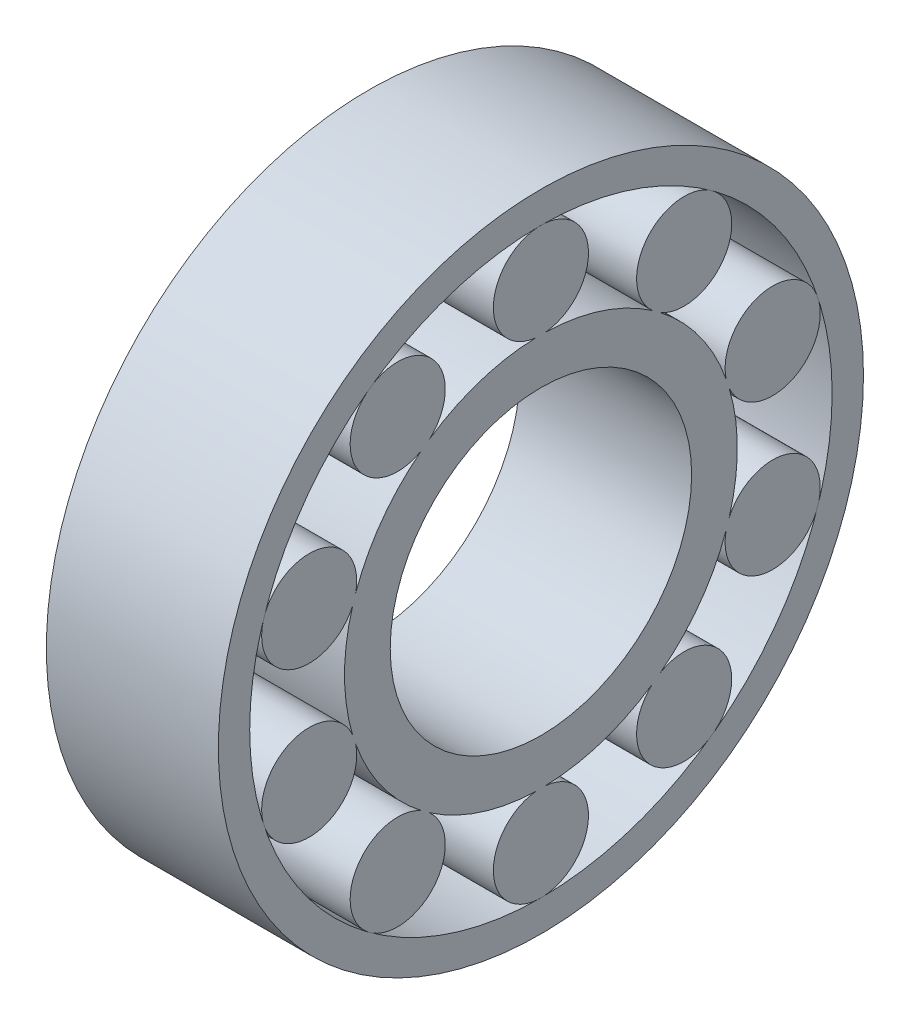
ISO-10303-21;
HEADER;
FILE_DESCRIPTION(('STEP AP214'),'2;1');
FILE_NAME('part.step','',(''),(''),'','','');
FILE_SCHEMA(('AUTOMOTIVE_DESIGN { 1 0 10303 214 1 1 1 1 }'));
ENDSEC;
DATA;
#1=APPLICATION_CONTEXT('core data for automotive mechanical design processes');
#2=APPLICATION_PROTOCOL_DEFINITION('international standard','automotive_design',2000,#1);
#3=PRODUCT_CONTEXT('',#1,'mechanical');
#4=PRODUCT('Part','Part','',(#3));
#5=PRODUCT_RELATED_PRODUCT_CATEGORY('part','',(#4));
#6=PRODUCT_DEFINITION_FORMATION('','',#4);
#7=PRODUCT_DEFINITION_CONTEXT('part definition',#1,'design');
#8=PRODUCT_DEFINITION('design','',#6,#7);
#9=PRODUCT_DEFINITION_SHAPE('','',#8);
#10=(LENGTH_UNIT() NAMED_UNIT(*) SI_UNIT(.MILLI.,.METRE.));
#11=(NAMED_UNIT(*) PLANE_ANGLE_UNIT() SI_UNIT($,.RADIAN.));
#12=(NAMED_UNIT(*) SI_UNIT($,.STERADIAN.) SOLID_ANGLE_UNIT());
#13=UNCERTAINTY_MEASURE_WITH_UNIT(LENGTH_MEASURE(1.E-05),#10,'distance_accuracy_value','');
#14=(GEOMETRIC_REPRESENTATION_CONTEXT(3) GLOBAL_UNCERTAINTY_ASSIGNED_CONTEXT((#13)) GLOBAL_UNIT_ASSIGNED_CONTEXT((#10,
#11,#12)) REPRESENTATION_CONTEXT('',''));
#15=CARTESIAN_POINT('',(0.,0.,0.));
#16=DIRECTION('',(0.,0.,1.));
#17=DIRECTION('',(1.,0.,0.));
#18=AXIS2_PLACEMENT_3D('',#15,#16,#17);
#19=CARTESIAN_POINT('',(12.7,0.,0.));
#20=DIRECTION('',(1.,0.,0.));
#21=DIRECTION('',(0.,0.,-1.));
#22=AXIS2_PLACEMENT_3D('',#19,#20,#21);
#23=PLANE('',#22);
#24=CARTESIAN_POINT('',(12.7,0.,0.));
#25=DIRECTION('',(1.,0.,0.));
#26=DIRECTION('',(0.,0.,-1.));
#27=AXIS2_PLACEMENT_3D('',#24,#25,#26);
#28=CIRCLE('',#27,21.5);
#29=CARTESIAN_POINT('',(12.7,0.,-21.5));
#30=VERTEX_POINT('',#29);
#31=EDGE_CURVE('E12',#30,#30,#28,.T.);
#32=ORIENTED_EDGE('',*,*,#31,.F.);
#33=EDGE_LOOP('',(#32));
#34=FACE_BOUND('',#33,.T.);
#35=CARTESIAN_POINT('',(12.7,0.,0.));
#36=DIRECTION('',(1.,0.,0.));
#37=DIRECTION('',(0.,0.,-1.));
#38=AXIS2_PLACEMENT_3D('',#35,#36,#37);
#39=CIRCLE('',#38,23.8125);
#40=CARTESIAN_POINT('',(12.7,0.,-23.8125));
#41=VERTEX_POINT('',#40);
#42=EDGE_CURVE('E71',#41,#41,#39,.T.);
#43=ORIENTED_EDGE('',*,*,#42,.T.);
#44=EDGE_LOOP('',(#43));
#45=FACE_BOUND('',#44,.T.);
#46=ADVANCED_FACE('F56',(#34,#45),#23,.T.);
#47=CARTESIAN_POINT('',(0.,0.,0.));
#48=DIRECTION('',(1.,0.,0.));
#49=DIRECTION('',(0.,0.,-1.));
#50=AXIS2_PLACEMENT_3D('',#47,#48,#49);
#51=PLANE('',#50);
#52=CARTESIAN_POINT('',(0.,0.,0.));
#53=DIRECTION('',(1.,0.,0.));
#54=DIRECTION('',(0.,0.,-1.));
#55=AXIS2_PLACEMENT_3D('',#52,#53,#54);
#56=CIRCLE('',#55,21.5);
#57=CARTESIAN_POINT('',(0.,0.,-21.5));
#58=VERTEX_POINT('',#57);
#59=EDGE_CURVE('E64',#58,#58,#56,.T.);
#60=ORIENTED_EDGE('',*,*,#59,.T.);
#61=EDGE_LOOP('',(#60));
#62=FACE_BOUND('',#61,.T.);
#63=CARTESIAN_POINT('',(0.,0.,0.));
#64=DIRECTION('',(1.,0.,0.));
#65=DIRECTION('',(0.,0.,-1.));
#66=AXIS2_PLACEMENT_3D('',#63,#64,#65);
#67=CIRCLE('',#66,23.8125);
#68=CARTESIAN_POINT('',(0.,0.,-23.8125));
#69=VERTEX_POINT('',#68);
#70=EDGE_CURVE('E70',#69,#69,#67,.T.);
#71=ORIENTED_EDGE('',*,*,#70,.F.);
#72=EDGE_LOOP('',(#71));
#73=FACE_BOUND('',#72,.T.);
#74=ADVANCED_FACE('F62',(#62,#73),#51,.F.);
#75=CARTESIAN_POINT('',(12.7,0.,0.));
#76=DIRECTION('',(-1.,0.,0.));
#77=DIRECTION('',(0.,0.,1.));
#78=AXIS2_PLACEMENT_3D('',#75,#76,#77);
#79=CYLINDRICAL_SURFACE('',#78,23.8125);
#80=ORIENTED_EDGE('',*,*,#42,.F.);
#81=EDGE_LOOP('',(#80));
#82=FACE_BOUND('',#81,.T.);
#83=ORIENTED_EDGE('',*,*,#70,.T.);
#84=EDGE_LOOP('',(#83));
#85=FACE_BOUND('',#84,.T.);
#86=ADVANCED_FACE('F81',(#82,#85),#79,.T.);
#87=CARTESIAN_POINT('',(0.,0.,0.));
#88=DIRECTION('',(1.,0.,0.));
#89=DIRECTION('',(0.,0.,-1.));
#90=AXIS2_PLACEMENT_3D('',#87,#88,#89);
#91=CYLINDRICAL_SURFACE('',#90,21.5);
#92=ORIENTED_EDGE('',*,*,#31,.T.);
#93=EDGE_LOOP('',(#92));
#94=FACE_BOUND('',#93,.T.);
#95=ORIENTED_EDGE('',*,*,#59,.F.);
#96=EDGE_LOOP('',(#95));
#97=FACE_BOUND('',#96,.T.);
#98=ADVANCED_FACE('F85',(#94,#97),#91,.F.);
#99=CLOSED_SHELL('',(#46,#74,#86,#98));
#100=MANIFOLD_SOLID_BREP('B2',#99);
#101=CARTESIAN_POINT('',(0.,0.,0.));
#102=DIRECTION('',(1.,0.,0.));
#103=DIRECTION('',(0.,0.,-1.));
#104=AXIS2_PLACEMENT_3D('',#101,#102,#103);
#105=CYLINDRICAL_SURFACE('',#104,14.5);
#106=DIRECTION('',(1.,0.,0.));
#107=VECTOR('',#106,1.);
#108=CARTESIAN_POINT('',(6.35,11.5161112431725,8.81074241110673));
#109=LINE('',#108,#107);
#110=CARTESIAN_POINT('',(0.,11.5161112431725,8.81074241110675));
#111=VERTEX_POINT('',#110);
#112=CARTESIAN_POINT('',(12.7,11.5161112431725,8.81074241110675));
#113=VERTEX_POINT('',#112);
#114=EDGE_CURVE('E60',#111,#113,#109,.T.);
#115=ORIENTED_EDGE('',*,*,#114,.F.);
#116=CARTESIAN_POINT('',(0.,0.,0.));
#117=DIRECTION('',(1.,0.,0.));
#118=DIRECTION('',(0.,0.,-1.));
#119=AXIS2_PLACEMENT_3D('',#116,#117,#118);
#120=CIRCLE('',#119,14.5);
#121=CARTESIAN_POINT('',(0.,4.82083990023876,13.6751417782876));
#122=VERTEX_POINT('',#121);
#123=EDGE_CURVE('E257',#111,#122,#120,.T.);
#124=ORIENTED_EDGE('',*,*,#123,.T.);
#125=DIRECTION('',(1.,0.,0.));
#126=VECTOR('',#125,1.);
#127=CARTESIAN_POINT('',(6.35,4.82083990023876,13.6751417782876));
#128=LINE('',#127,#126);
#129=CARTESIAN_POINT('',(12.7,4.82083990023876,13.6751417782876));
#130=VERTEX_POINT('',#129);
#131=EDGE_CURVE('E425',#130,#122,#128,.F.);
#132=ORIENTED_EDGE('',*,*,#131,.F.);
#133=CARTESIAN_POINT('',(12.7,0.,0.));
#134=DIRECTION('',(1.,0.,0.));
#135=DIRECTION('',(0.,0.,-1.));
#136=AXIS2_PLACEMENT_3D('',#133,#134,#135);
#137=CIRCLE('',#136,14.5);
#138=EDGE_CURVE('E131',#113,#130,#137,.T.);
#139=ORIENTED_EDGE('',*,*,#138,.F.);
#140=EDGE_LOOP('',(#115,#124,#132,#139));
#141=FACE_BOUND('',#140,.T.);
#142=ADVANCED_FACE('F113',(#141),#105,.T.);
#143=DIRECTION('',(1.,0.,0.));
#144=VECTOR('',#143,1.);
#145=CARTESIAN_POINT('',(6.35,4.13790525383129,13.8970406961452));
#146=LINE('',#145,#144);
#147=CARTESIAN_POINT('',(0.,4.13790525383129,13.8970406961452));
#148=VERTEX_POINT('',#147);
#149=CARTESIAN_POINT('',(12.7,4.13790525383129,13.8970406961452));
#150=VERTEX_POINT('',#149);
#151=EDGE_CURVE('E271',#148,#150,#146,.T.);
#152=ORIENTED_EDGE('',*,*,#151,.F.);
#153=CARTESIAN_POINT('',(0.,-4.13790525382628,13.8970406961467));
#154=VERTEX_POINT('',#153);
#155=EDGE_CURVE('E439',#148,#154,#120,.T.);
#156=ORIENTED_EDGE('',*,*,#155,.T.);
#157=DIRECTION('',(1.,0.,0.));
#158=VECTOR('',#157,1.);
#159=CARTESIAN_POINT('',(6.35,-4.13790525382629,13.8970406961467));
#160=LINE('',#159,#158);
#161=CARTESIAN_POINT('',(12.7,-4.13790525382628,13.8970406961467));
#162=VERTEX_POINT('',#161);
#163=EDGE_CURVE('E411',#162,#154,#160,.F.);
#164=ORIENTED_EDGE('',*,*,#163,.F.);
#165=EDGE_CURVE('E436',#150,#162,#137,.T.);
#166=ORIENTED_EDGE('',*,*,#165,.F.);
#167=EDGE_LOOP('',(#152,#156,#164,#166));
#168=FACE_BOUND('',#167,.T.);
#169=ADVANCED_FACE('F532',(#168),#105,.T.);
#170=DIRECTION('',(1.,0.,0.));
#171=VECTOR('',#170,1.);
#172=CARTESIAN_POINT('',(6.35,-4.82083990024673,13.6751417782848));
#173=LINE('',#172,#171);
#174=CARTESIAN_POINT('',(0.,-4.82083990024675,13.6751417782847));
#175=VERTEX_POINT('',#174);
#176=CARTESIAN_POINT('',(12.7,-4.82083990024675,13.6751417782847));
#177=VERTEX_POINT('',#176);
#178=EDGE_CURVE('E416',#175,#177,#173,.T.);
#179=ORIENTED_EDGE('',*,*,#178,.F.);
#180=CARTESIAN_POINT('',(0.,-11.5161112431625,8.81074241111981));
#181=VERTEX_POINT('',#180);
#182=EDGE_CURVE('E444',#175,#181,#120,.T.);
#183=ORIENTED_EDGE('',*,*,#182,.T.);
#184=DIRECTION('',(1.,0.,0.));
#185=VECTOR('',#184,1.);
#186=CARTESIAN_POINT('',(6.35,-11.5161112431625,8.81074241111984));
#187=LINE('',#186,#185);
#188=CARTESIAN_POINT('',(12.7,-11.5161112431625,8.81074241111981));
#189=VERTEX_POINT('',#188);
#190=EDGE_CURVE('E407',#189,#181,#187,.F.);
#191=ORIENTED_EDGE('',*,*,#190,.F.);
#192=EDGE_CURVE('E493',#177,#189,#137,.T.);
#193=ORIENTED_EDGE('',*,*,#192,.F.);
#194=EDGE_LOOP('',(#179,#183,#191,#193));
#195=FACE_BOUND('',#194,.T.);
#196=ADVANCED_FACE('F496',(#195),#105,.T.);
#197=DIRECTION('',(1.,0.,0.));
#198=VECTOR('',#197,1.);
#199=CARTESIAN_POINT('',(6.35,-11.9381880667453,8.22980350209049));
#200=LINE('',#199,#198);
#201=CARTESIAN_POINT('',(0.,-11.9381880667452,8.22980350209052));
#202=VERTEX_POINT('',#201);
#203=CARTESIAN_POINT('',(12.7,-11.9381880667452,8.22980350209052));
#204=VERTEX_POINT('',#203);
#205=EDGE_CURVE('E408',#202,#204,#200,.T.);
#206=ORIENTED_EDGE('',*,*,#205,.F.);
#207=CARTESIAN_POINT('',(0.,-14.4955541558351,0.359039991158161));
#208=VERTEX_POINT('',#207);
#209=EDGE_CURVE('E447',#202,#208,#120,.T.);
#210=ORIENTED_EDGE('',*,*,#209,.T.);
#211=DIRECTION('',(1.,0.,0.));
#212=VECTOR('',#211,1.);
#213=CARTESIAN_POINT('',(6.35,-14.4955541558351,0.35903999115814));
#214=LINE('',#213,#212);
#215=CARTESIAN_POINT('',(12.7,-14.4955541558351,0.359039991158161));
#216=VERTEX_POINT('',#215);
#217=EDGE_CURVE('E399',#216,#208,#214,.F.);
#218=ORIENTED_EDGE('',*,*,#217,.F.);
#219=EDGE_CURVE('E495',#204,#216,#137,.T.);
#220=ORIENTED_EDGE('',*,*,#219,.F.);
#221=EDGE_LOOP('',(#206,#210,#218,#220));
#222=FACE_BOUND('',#221,.T.);
#223=ADVANCED_FACE('F504',(#222),#105,.T.);
#224=DIRECTION('',(1.,0.,0.));
#225=VECTOR('',#224,1.);
#226=CARTESIAN_POINT('',(6.35,-14.495554155835,-0.359039991162222));
#227=LINE('',#226,#225);
#228=CARTESIAN_POINT('',(0.,-14.495554155835,-0.359039991162243));
#229=VERTEX_POINT('',#228);
#230=CARTESIAN_POINT('',(12.7,-14.495554155835,-0.359039991162243));
#231=VERTEX_POINT('',#230);
#232=EDGE_CURVE('E405',#229,#231,#227,.T.);
#233=ORIENTED_EDGE('',*,*,#232,.F.);
#234=CARTESIAN_POINT('',(0.,-11.9381880667326,-8.22980350210881));
#235=VERTEX_POINT('',#234);
#236=EDGE_CURVE('E448',#229,#235,#120,.T.);
#237=ORIENTED_EDGE('',*,*,#236,.T.);
#238=DIRECTION('',(1.,0.,0.));
#239=VECTOR('',#238,1.);
#240=CARTESIAN_POINT('',(6.35,-11.9381880667326,-8.22980350210885));
#241=LINE('',#240,#239);
#242=CARTESIAN_POINT('',(12.7,-11.9381880667326,-8.22980350210881));
#243=VERTEX_POINT('',#242);
#244=EDGE_CURVE('E388',#243,#235,#241,.F.);
#245=ORIENTED_EDGE('',*,*,#244,.F.);
#246=EDGE_CURVE('E489',#231,#243,#137,.T.);
#247=ORIENTED_EDGE('',*,*,#246,.F.);
#248=EDGE_LOOP('',(#233,#237,#245,#247));
#249=FACE_BOUND('',#248,.T.);
#250=ADVANCED_FACE('F506',(#249),#105,.T.);
#251=DIRECTION('',(1.,0.,0.));
#252=VECTOR('',#251,1.);
#253=CARTESIAN_POINT('',(6.35,-11.5161112431717,-8.81074241110787));
#254=LINE('',#253,#252);
#255=CARTESIAN_POINT('',(0.,-11.5161112431717,-8.8107424111079));
#256=VERTEX_POINT('',#255);
#257=CARTESIAN_POINT('',(12.7,-11.5161112431717,-8.8107424111079));
#258=VERTEX_POINT('',#257);
#259=EDGE_CURVE('E391',#256,#258,#254,.T.);
#260=ORIENTED_EDGE('',*,*,#259,.F.);
#261=CARTESIAN_POINT('',(0.,-4.82083990021603,-13.6751417782956));
#262=VERTEX_POINT('',#261);
#263=EDGE_CURVE('E453',#256,#262,#120,.T.);
#264=ORIENTED_EDGE('',*,*,#263,.T.);
#265=DIRECTION('',(1.,0.,0.));
#266=VECTOR('',#265,1.);
#267=CARTESIAN_POINT('',(6.35,-4.82083990021604,-13.6751417782956));
#268=LINE('',#267,#266);
#269=CARTESIAN_POINT('',(12.7,-4.82083990021603,-13.6751417782956));
#270=VERTEX_POINT('',#269);
#271=EDGE_CURVE('E385',#270,#262,#268,.F.);
#272=ORIENTED_EDGE('',*,*,#271,.F.);
#273=EDGE_CURVE('E488',#258,#270,#137,.T.);
#274=ORIENTED_EDGE('',*,*,#273,.F.);
#275=EDGE_LOOP('',(#260,#264,#272,#274));
#276=FACE_BOUND('',#275,.T.);
#277=ADVANCED_FACE('F511',(#276),#105,.T.);
#278=DIRECTION('',(1.,0.,0.));
#279=VECTOR('',#278,1.);
#280=CARTESIAN_POINT('',(6.35,-4.13790525385293,-13.8970406961387));
#281=LINE('',#280,#279);
#282=CARTESIAN_POINT('',(0.,-4.13790525385294,-13.8970406961387));
#283=VERTEX_POINT('',#282);
#284=CARTESIAN_POINT('',(12.7,-4.13790525385294,-13.8970406961387));
#285=VERTEX_POINT('',#284);
#286=EDGE_CURVE('E387',#283,#285,#281,.T.);
#287=ORIENTED_EDGE('',*,*,#286,.F.);
#288=CARTESIAN_POINT('',(0.,4.1379052538615,-13.8970406961362));
#289=VERTEX_POINT('',#288);
#290=EDGE_CURVE('E458',#283,#289,#120,.T.);
#291=ORIENTED_EDGE('',*,*,#290,.T.);
#292=DIRECTION('',(1.,0.,0.));
#293=VECTOR('',#292,1.);
#294=CARTESIAN_POINT('',(6.35,4.13790525386153,-13.8970406961362));
#295=LINE('',#294,#293);
#296=CARTESIAN_POINT('',(12.7,4.1379052538615,-13.8970406961362));
#297=VERTEX_POINT('',#296);
#298=EDGE_CURVE('E372',#297,#289,#295,.F.);
#299=ORIENTED_EDGE('',*,*,#298,.F.);
#300=EDGE_CURVE('E486',#285,#297,#137,.T.);
#301=ORIENTED_EDGE('',*,*,#300,.F.);
#302=EDGE_LOOP('',(#287,#291,#299,#301));
#303=FACE_BOUND('',#302,.T.);
#304=ADVANCED_FACE('F516',(#303),#105,.T.);
#305=DIRECTION('',(1.,0.,0.));
#306=VECTOR('',#305,1.);
#307=CARTESIAN_POINT('',(6.35,4.82083990021062,-13.6751417782975));
#308=LINE('',#307,#306);
#309=CARTESIAN_POINT('',(0.,4.82083990021065,-13.6751417782975));
#310=VERTEX_POINT('',#309);
#311=CARTESIAN_POINT('',(12.7,4.82083990021065,-13.6751417782975));
#312=VERTEX_POINT('',#311);
#313=EDGE_CURVE('E378',#310,#312,#308,.T.);
#314=ORIENTED_EDGE('',*,*,#313,.F.);
#315=CARTESIAN_POINT('',(0.,11.5161112431843,-8.81074241109131));
#316=VERTEX_POINT('',#315);
#317=EDGE_CURVE('E463',#310,#316,#120,.T.);
#318=ORIENTED_EDGE('',*,*,#317,.T.);
#319=DIRECTION('',(1.,0.,0.));
#320=VECTOR('',#319,1.);
#321=CARTESIAN_POINT('',(6.35,11.5161112431844,-8.81074241109129));
#322=LINE('',#321,#320);
#323=CARTESIAN_POINT('',(12.7,11.5161112431843,-8.81074241109131));
#324=VERTEX_POINT('',#323);
#325=EDGE_CURVE('E368',#324,#316,#322,.F.);
#326=ORIENTED_EDGE('',*,*,#325,.F.);
#327=EDGE_CURVE('E482',#312,#324,#137,.T.);
#328=ORIENTED_EDGE('',*,*,#327,.F.);
#329=EDGE_LOOP('',(#314,#318,#326,#328));
#330=FACE_BOUND('',#329,.T.);
#331=ADVANCED_FACE('F524',(#330),#105,.T.);
#332=DIRECTION('',(1.,0.,0.));
#333=VECTOR('',#332,1.);
#334=CARTESIAN_POINT('',(6.35,11.9381880667226,-8.22980350212337));
#335=LINE('',#334,#333);
#336=CARTESIAN_POINT('',(0.,11.9381880667226,-8.22980350212336));
#337=VERTEX_POINT('',#336);
#338=CARTESIAN_POINT('',(12.7,11.9381880667226,-8.22980350212336));
#339=VERTEX_POINT('',#338);
#340=EDGE_CURVE('E367',#337,#339,#335,.T.);
#341=ORIENTED_EDGE('',*,*,#340,.F.);
#342=CARTESIAN_POINT('',(0.,14.4955541558357,-0.359039991136616));
#343=VERTEX_POINT('',#342);
#344=EDGE_CURVE('E265',#337,#343,#120,.T.);
#345=ORIENTED_EDGE('',*,*,#344,.T.);
#346=DIRECTION('',(1.,0.,0.));
#347=VECTOR('',#346,1.);
#348=CARTESIAN_POINT('',(6.35,14.4955541558357,-0.359039991136674));
#349=LINE('',#348,#347);
#350=CARTESIAN_POINT('',(12.7,14.4955541558357,-0.359039991136616));
#351=VERTEX_POINT('',#350);
#352=EDGE_CURVE('E360',#351,#343,#349,.F.);
#353=ORIENTED_EDGE('',*,*,#352,.F.);
#354=EDGE_CURVE('E347',#339,#351,#137,.T.);
#355=ORIENTED_EDGE('',*,*,#354,.F.);
#356=EDGE_LOOP('',(#341,#345,#353,#355));
#357=FACE_BOUND('',#356,.T.);
#358=ADVANCED_FACE('F480',(#357),#105,.T.);
#359=CARTESIAN_POINT('',(12.7,0.,0.));
#360=DIRECTION('',(1.,0.,0.));
#361=DIRECTION('',(0.,0.,-1.));
#362=AXIS2_PLACEMENT_3D('',#359,#360,#361);
#363=PLANE('',#362);
#364=CARTESIAN_POINT('',(12.7,14.4955541558357,0.359039991135765));
#365=VERTEX_POINT('',#364);
#366=CARTESIAN_POINT('',(12.7,11.9381880667341,8.22980350210672));
#367=VERTEX_POINT('',#366);
#368=EDGE_CURVE('E348',#365,#367,#137,.T.);
#369=ORIENTED_EDGE('',*,*,#368,.T.);
#370=CARTESIAN_POINT('',(12.7,14.5530629487508,10.5734191450063));
#371=DIRECTION('',(1.,0.,0.));
#372=DIRECTION('',(0.,0.,-1.));
#373=AXIS2_PLACEMENT_3D('',#370,#371,#372);
#374=CIRCLE('',#373,3.5114249145106);
#375=EDGE_CURVE('E267',#367,#113,#374,.T.);
#376=ORIENTED_EDGE('',*,*,#375,.T.);
#377=ORIENTED_EDGE('',*,*,#138,.T.);
#378=CARTESIAN_POINT('',(12.7,5.55877540600532,17.108151553919));
#379=DIRECTION('',(1.,0.,0.));
#380=DIRECTION('',(0.,0.,-1.));
#381=AXIS2_PLACEMENT_3D('',#378,#379,#380);
#382=CIRCLE('',#381,3.51142491451146);
#383=EDGE_CURVE('E276',#130,#150,#382,.T.);
#384=ORIENTED_EDGE('',*,*,#383,.T.);
#385=ORIENTED_EDGE('',*,*,#165,.T.);
#386=CARTESIAN_POINT('',(12.7,-5.55877540600723,17.1081515539184));
#387=DIRECTION('',(1.,0.,0.));
#388=DIRECTION('',(0.,0.,-1.));
#389=AXIS2_PLACEMENT_3D('',#386,#387,#388);
#390=CIRCLE('',#389,3.51142491451233);
#391=EDGE_CURVE('E290',#162,#177,#390,.T.);
#392=ORIENTED_EDGE('',*,*,#391,.T.);
#393=ORIENTED_EDGE('',*,*,#192,.T.);
#394=CARTESIAN_POINT('',(12.7,-14.553062948752,10.5734191450047));
#395=DIRECTION('',(1.,0.,0.));
#396=DIRECTION('',(0.,0.,-1.));
#397=AXIS2_PLACEMENT_3D('',#394,#395,#396);
#398=CIRCLE('',#397,3.51142491451289);
#399=EDGE_CURVE('E293',#189,#204,#398,.T.);
#400=ORIENTED_EDGE('',*,*,#399,.T.);
#401=ORIENTED_EDGE('',*,*,#219,.T.);
#402=CARTESIAN_POINT('',(12.7,-17.9885750854903,-2.53275452224936E-12));
#403=DIRECTION('',(1.,0.,0.));
#404=DIRECTION('',(0.,0.,-1.));
#405=AXIS2_PLACEMENT_3D('',#402,#403,#404);
#406=CIRCLE('',#405,3.51142491451287);
#407=EDGE_CURVE('E304',#216,#231,#406,.T.);
#408=ORIENTED_EDGE('',*,*,#407,.T.);
#409=ORIENTED_EDGE('',*,*,#246,.T.);
#410=CARTESIAN_POINT('',(12.7,-14.5530629487508,-10.5734191450094));
#411=DIRECTION('',(1.,0.,0.));
#412=DIRECTION('',(0.,0.,-1.));
#413=AXIS2_PLACEMENT_3D('',#410,#411,#412);
#414=CIRCLE('',#413,3.51142491451231);
#415=EDGE_CURVE('E313',#243,#258,#414,.T.);
#416=ORIENTED_EDGE('',*,*,#415,.T.);
#417=ORIENTED_EDGE('',*,*,#273,.T.);
#418=CARTESIAN_POINT('',(12.7,-5.55877540600532,-17.108151553922));
#419=DIRECTION('',(1.,0.,0.));
#420=DIRECTION('',(0.,0.,-1.));
#421=AXIS2_PLACEMENT_3D('',#418,#419,#420);
#422=CIRCLE('',#421,3.51142491451139);
#423=EDGE_CURVE('E317',#270,#285,#422,.T.);
#424=ORIENTED_EDGE('',*,*,#423,.T.);
#425=ORIENTED_EDGE('',*,*,#300,.T.);
#426=CARTESIAN_POINT('',(12.7,5.55877540600723,-17.1081515539214));
#427=DIRECTION('',(1.,0.,0.));
#428=DIRECTION('',(0.,0.,-1.));
#429=AXIS2_PLACEMENT_3D('',#426,#427,#428);
#430=CIRCLE('',#429,3.51142491451047);
#431=EDGE_CURVE('E330',#297,#312,#430,.T.);
#432=ORIENTED_EDGE('',*,*,#431,.T.);
#433=ORIENTED_EDGE('',*,*,#327,.T.);
#434=CARTESIAN_POINT('',(12.7,14.553062948752,-10.5734191450077));
#435=DIRECTION('',(1.,0.,0.));
#436=DIRECTION('',(0.,0.,-1.));
#437=AXIS2_PLACEMENT_3D('',#434,#435,#436);
#438=CIRCLE('',#437,3.51142491450987);
#439=EDGE_CURVE('E333',#324,#339,#438,.T.);
#440=ORIENTED_EDGE('',*,*,#439,.T.);
#441=ORIENTED_EDGE('',*,*,#354,.T.);
#442=CARTESIAN_POINT('',(12.7,17.9885750854903,-5.28232907361448E-13));
#443=DIRECTION('',(1.,0.,0.));
#444=DIRECTION('',(0.,0.,-1.));
#445=AXIS2_PLACEMENT_3D('',#442,#443,#444);
#446=CIRCLE('',#445,3.51142491450983);
#447=EDGE_CURVE('E336',#351,#365,#446,.T.);
#448=ORIENTED_EDGE('',*,*,#447,.T.);
#449=EDGE_LOOP('',(#369,#376,#377,#384,#385,#392,#393,#400,#401,#408,#409,#416,#417,#424,#425,
#432,#433,#440,#441,#448));
#450=FACE_BOUND('',#449,.T.);
#451=CARTESIAN_POINT('',(12.7,0.,0.));
#452=DIRECTION('',(1.,0.,0.));
#453=DIRECTION('',(0.,0.,-1.));
#454=AXIS2_PLACEMENT_3D('',#451,#452,#453);
#455=CIRCLE('',#454,11.125);
#456=CARTESIAN_POINT('',(12.7,0.,-11.125));
#457=VERTEX_POINT('',#456);
#458=EDGE_CURVE('E354',#457,#457,#455,.T.);
#459=ORIENTED_EDGE('',*,*,#458,.F.);
#460=EDGE_LOOP('',(#459));
#461=FACE_BOUND('',#460,.T.);
#462=ADVANCED_FACE('F432',(#450,#461),#363,.T.);
#463=CARTESIAN_POINT('',(12.7,0.,0.));
#464=DIRECTION('',(-1.,0.,0.));
#465=DIRECTION('',(0.,0.,1.));
#466=AXIS2_PLACEMENT_3D('',#463,#464,#465);
#467=CYLINDRICAL_SURFACE('',#466,11.125);
#468=ORIENTED_EDGE('',*,*,#458,.T.);
#469=EDGE_LOOP('',(#468));
#470=FACE_BOUND('',#469,.T.);
#471=CARTESIAN_POINT('',(0.,0.,0.));
#472=DIRECTION('',(1.,0.,0.));
#473=DIRECTION('',(0.,0.,-1.));
#474=AXIS2_PLACEMENT_3D('',#471,#472,#473);
#475=CIRCLE('',#474,11.125);
#476=CARTESIAN_POINT('',(0.,0.,-11.125));
#477=VERTEX_POINT('',#476);
#478=EDGE_CURVE('E259',#477,#477,#475,.T.);
#479=ORIENTED_EDGE('',*,*,#478,.F.);
#480=EDGE_LOOP('',(#479));
#481=FACE_BOUND('',#480,.T.);
#482=ADVANCED_FACE('F546',(#470,#481),#467,.F.);
#483=CARTESIAN_POINT('',(0.,0.,0.));
#484=DIRECTION('',(1.,0.,0.));
#485=DIRECTION('',(0.,0.,-1.));
#486=AXIS2_PLACEMENT_3D('',#483,#484,#485);
#487=PLANE('',#486);
#488=ORIENTED_EDGE('',*,*,#478,.T.);
#489=EDGE_LOOP('',(#488));
#490=FACE_BOUND('',#489,.T.);
#491=ORIENTED_EDGE('',*,*,#123,.F.);
#492=CARTESIAN_POINT('',(0.,14.5530629487508,10.5734191450063));
#493=DIRECTION('',(1.,0.,0.));
#494=DIRECTION('',(0.,0.,-1.));
#495=AXIS2_PLACEMENT_3D('',#492,#493,#494);
#496=CIRCLE('',#495,3.5114249145106);
#497=CARTESIAN_POINT('',(0.,11.9381880667341,8.22980350210672));
#498=VERTEX_POINT('',#497);
#499=EDGE_CURVE('E270',#498,#111,#496,.T.);
#500=ORIENTED_EDGE('',*,*,#499,.F.);
#501=CARTESIAN_POINT('',(0.,14.4955541558357,0.359039991135765));
#502=VERTEX_POINT('',#501);
#503=EDGE_CURVE('E249',#502,#498,#120,.T.);
#504=ORIENTED_EDGE('',*,*,#503,.F.);
#505=CARTESIAN_POINT('',(0.,17.9885750854903,-5.28232907361448E-13));
#506=DIRECTION('',(1.,0.,0.));
#507=DIRECTION('',(0.,0.,-1.));
#508=AXIS2_PLACEMENT_3D('',#505,#506,#507);
#509=CIRCLE('',#508,3.51142491450983);
#510=EDGE_CURVE('E344',#343,#502,#509,.T.);
#511=ORIENTED_EDGE('',*,*,#510,.F.);
#512=ORIENTED_EDGE('',*,*,#344,.F.);
#513=CARTESIAN_POINT('',(0.,14.553062948752,-10.5734191450077));
#514=DIRECTION('',(1.,0.,0.));
#515=DIRECTION('',(0.,0.,-1.));
#516=AXIS2_PLACEMENT_3D('',#513,#514,#515);
#517=CIRCLE('',#516,3.51142491450987);
#518=EDGE_CURVE('E332',#316,#337,#517,.T.);
#519=ORIENTED_EDGE('',*,*,#518,.F.);
#520=ORIENTED_EDGE('',*,*,#317,.F.);
#521=CARTESIAN_POINT('',(0.,5.55877540600723,-17.1081515539214));
#522=DIRECTION('',(1.,0.,0.));
#523=DIRECTION('',(0.,0.,-1.));
#524=AXIS2_PLACEMENT_3D('',#521,#522,#523);
#525=CIRCLE('',#524,3.51142491451047);
#526=EDGE_CURVE('E323',#289,#310,#525,.T.);
#527=ORIENTED_EDGE('',*,*,#526,.F.);
#528=ORIENTED_EDGE('',*,*,#290,.F.);
#529=CARTESIAN_POINT('',(0.,-5.55877540600532,-17.108151553922));
#530=DIRECTION('',(1.,0.,0.));
#531=DIRECTION('',(0.,0.,-1.));
#532=AXIS2_PLACEMENT_3D('',#529,#530,#531);
#533=CIRCLE('',#532,3.51142491451139);
#534=EDGE_CURVE('E312',#262,#283,#533,.T.);
#535=ORIENTED_EDGE('',*,*,#534,.F.);
#536=ORIENTED_EDGE('',*,*,#263,.F.);
#537=CARTESIAN_POINT('',(0.,-14.5530629487508,-10.5734191450094));
#538=DIRECTION('',(1.,0.,0.));
#539=DIRECTION('',(0.,0.,-1.));
#540=AXIS2_PLACEMENT_3D('',#537,#538,#539);
#541=CIRCLE('',#540,3.51142491451231);
#542=EDGE_CURVE('E307',#235,#256,#541,.T.);
#543=ORIENTED_EDGE('',*,*,#542,.F.);
#544=ORIENTED_EDGE('',*,*,#236,.F.);
#545=CARTESIAN_POINT('',(0.,-17.9885750854903,-2.53275452224936E-12));
#546=DIRECTION('',(1.,0.,0.));
#547=DIRECTION('',(0.,0.,-1.));
#548=AXIS2_PLACEMENT_3D('',#545,#546,#547);
#549=CIRCLE('',#548,3.51142491451287);
#550=EDGE_CURVE('E296',#208,#229,#549,.T.);
#551=ORIENTED_EDGE('',*,*,#550,.F.);
#552=ORIENTED_EDGE('',*,*,#209,.F.);
#553=CARTESIAN_POINT('',(0.,-14.553062948752,10.5734191450047));
#554=DIRECTION('',(1.,0.,0.));
#555=DIRECTION('',(0.,0.,-1.));
#556=AXIS2_PLACEMENT_3D('',#553,#554,#555);
#557=CIRCLE('',#556,3.51142491451289);
#558=EDGE_CURVE('E292',#181,#202,#557,.T.);
#559=ORIENTED_EDGE('',*,*,#558,.F.);
#560=ORIENTED_EDGE('',*,*,#182,.F.);
#561=CARTESIAN_POINT('',(0.,-5.55877540600723,17.1081515539184));
#562=DIRECTION('',(1.,0.,0.));
#563=DIRECTION('',(0.,0.,-1.));
#564=AXIS2_PLACEMENT_3D('',#561,#562,#563);
#565=CIRCLE('',#564,3.51142491451233);
#566=EDGE_CURVE('E284',#154,#175,#565,.T.);
#567=ORIENTED_EDGE('',*,*,#566,.F.);
#568=ORIENTED_EDGE('',*,*,#155,.F.);
#569=CARTESIAN_POINT('',(0.,5.55877540600532,17.108151553919));
#570=DIRECTION('',(1.,0.,0.));
#571=DIRECTION('',(0.,0.,-1.));
#572=AXIS2_PLACEMENT_3D('',#569,#570,#571);
#573=CIRCLE('',#572,3.51142491451146);
#574=EDGE_CURVE('E277',#122,#148,#573,.T.);
#575=ORIENTED_EDGE('',*,*,#574,.F.);
#576=EDGE_LOOP('',(#491,#500,#504,#511,#512,#519,#520,#527,#528,#535,#536,#543,#544,#551,#552,
#559,#560,#567,#568,#575));
#577=FACE_BOUND('',#576,.T.);
#578=ADVANCED_FACE('F120',(#490,#577),#487,.F.);
#579=DIRECTION('',(1.,0.,0.));
#580=VECTOR('',#579,1.);
#581=CARTESIAN_POINT('',(6.35,11.9381880667341,8.22980350210674));
#582=LINE('',#581,#580);
#583=EDGE_CURVE('E121',#367,#498,#582,.F.);
#584=ORIENTED_EDGE('',*,*,#583,.F.);
#585=ORIENTED_EDGE('',*,*,#368,.F.);
#586=DIRECTION('',(1.,0.,0.));
#587=VECTOR('',#586,1.);
#588=CARTESIAN_POINT('',(6.35,14.4955541558357,0.359039991135823));
#589=LINE('',#588,#587);
#590=EDGE_CURVE('E251',#502,#365,#589,.T.);
#591=ORIENTED_EDGE('',*,*,#590,.F.);
#592=ORIENTED_EDGE('',*,*,#503,.T.);
#593=EDGE_LOOP('',(#584,#585,#591,#592));
#594=FACE_BOUND('',#593,.T.);
#595=ADVANCED_FACE('F248',(#594),#105,.T.);
#596=CARTESIAN_POINT('',(0.,17.9885750854903,-5.28232907361448E-13));
#597=DIRECTION('',(1.,0.,0.));
#598=DIRECTION('',(0.,0.,-1.));
#599=AXIS2_PLACEMENT_3D('',#596,#597,#598);
#600=CYLINDRICAL_SURFACE('',#599,3.51142491450983);
#601=ORIENTED_EDGE('',*,*,#510,.T.);
#602=ORIENTED_EDGE('',*,*,#590,.T.);
#603=ORIENTED_EDGE('',*,*,#447,.F.);
#604=ORIENTED_EDGE('',*,*,#352,.T.);
#605=EDGE_LOOP('',(#601,#602,#603,#604));
#606=FACE_BOUND('',#605,.T.);
#607=ADVANCED_FACE('F481',(#606),#600,.T.);
#608=CARTESIAN_POINT('',(0.,14.553062948752,-10.5734191450077));
#609=DIRECTION('',(1.,0.,0.));
#610=DIRECTION('',(0.,0.,-1.));
#611=AXIS2_PLACEMENT_3D('',#608,#609,#610);
#612=CYLINDRICAL_SURFACE('',#611,3.51142491450987);
#613=ORIENTED_EDGE('',*,*,#518,.T.);
#614=ORIENTED_EDGE('',*,*,#340,.T.);
#615=ORIENTED_EDGE('',*,*,#439,.F.);
#616=ORIENTED_EDGE('',*,*,#325,.T.);
#617=EDGE_LOOP('',(#613,#614,#615,#616));
#618=FACE_BOUND('',#617,.T.);
#619=ADVANCED_FACE('F523',(#618),#612,.T.);
#620=CARTESIAN_POINT('',(0.,5.55877540600723,-17.1081515539214));
#621=DIRECTION('',(1.,0.,0.));
#622=DIRECTION('',(0.,0.,-1.));
#623=AXIS2_PLACEMENT_3D('',#620,#621,#622);
#624=CYLINDRICAL_SURFACE('',#623,3.51142491451047);
#625=ORIENTED_EDGE('',*,*,#526,.T.);
#626=ORIENTED_EDGE('',*,*,#313,.T.);
#627=ORIENTED_EDGE('',*,*,#431,.F.);
#628=ORIENTED_EDGE('',*,*,#298,.T.);
#629=EDGE_LOOP('',(#625,#626,#627,#628));
#630=FACE_BOUND('',#629,.T.);
#631=ADVANCED_FACE('F525',(#630),#624,.T.);
#632=CARTESIAN_POINT('',(0.,-5.55877540600532,-17.108151553922));
#633=DIRECTION('',(1.,0.,0.));
#634=DIRECTION('',(0.,0.,-1.));
#635=AXIS2_PLACEMENT_3D('',#632,#633,#634);
#636=CYLINDRICAL_SURFACE('',#635,3.51142491451139);
#637=ORIENTED_EDGE('',*,*,#534,.T.);
#638=ORIENTED_EDGE('',*,*,#286,.T.);
#639=ORIENTED_EDGE('',*,*,#423,.F.);
#640=ORIENTED_EDGE('',*,*,#271,.T.);
#641=EDGE_LOOP('',(#637,#638,#639,#640));
#642=FACE_BOUND('',#641,.T.);
#643=ADVANCED_FACE('F520',(#642),#636,.T.);
#644=CARTESIAN_POINT('',(0.,-14.5530629487508,-10.5734191450094));
#645=DIRECTION('',(1.,0.,0.));
#646=DIRECTION('',(0.,0.,-1.));
#647=AXIS2_PLACEMENT_3D('',#644,#645,#646);
#648=CYLINDRICAL_SURFACE('',#647,3.51142491451231);
#649=ORIENTED_EDGE('',*,*,#542,.T.);
#650=ORIENTED_EDGE('',*,*,#259,.T.);
#651=ORIENTED_EDGE('',*,*,#415,.F.);
#652=ORIENTED_EDGE('',*,*,#244,.T.);
#653=EDGE_LOOP('',(#649,#650,#651,#652));
#654=FACE_BOUND('',#653,.T.);
#655=ADVANCED_FACE('F515',(#654),#648,.T.);
#656=CARTESIAN_POINT('',(0.,-17.9885750854903,-2.53275452224936E-12));
#657=DIRECTION('',(1.,0.,0.));
#658=DIRECTION('',(0.,0.,-1.));
#659=AXIS2_PLACEMENT_3D('',#656,#657,#658);
#660=CYLINDRICAL_SURFACE('',#659,3.51142491451287);
#661=ORIENTED_EDGE('',*,*,#550,.T.);
#662=ORIENTED_EDGE('',*,*,#232,.T.);
#663=ORIENTED_EDGE('',*,*,#407,.F.);
#664=ORIENTED_EDGE('',*,*,#217,.T.);
#665=EDGE_LOOP('',(#661,#662,#663,#664));
#666=FACE_BOUND('',#665,.T.);
#667=ADVANCED_FACE('F510',(#666),#660,.T.);
#668=CARTESIAN_POINT('',(0.,-14.553062948752,10.5734191450047));
#669=DIRECTION('',(1.,0.,0.));
#670=DIRECTION('',(0.,0.,-1.));
#671=AXIS2_PLACEMENT_3D('',#668,#669,#670);
#672=CYLINDRICAL_SURFACE('',#671,3.51142491451289);
#673=ORIENTED_EDGE('',*,*,#558,.T.);
#674=ORIENTED_EDGE('',*,*,#205,.T.);
#675=ORIENTED_EDGE('',*,*,#399,.F.);
#676=ORIENTED_EDGE('',*,*,#190,.T.);
#677=EDGE_LOOP('',(#673,#674,#675,#676));
#678=FACE_BOUND('',#677,.T.);
#679=ADVANCED_FACE('F505',(#678),#672,.T.);
#680=CARTESIAN_POINT('',(0.,-5.55877540600723,17.1081515539184));
#681=DIRECTION('',(1.,0.,0.));
#682=DIRECTION('',(0.,0.,-1.));
#683=AXIS2_PLACEMENT_3D('',#680,#681,#682);
#684=CYLINDRICAL_SURFACE('',#683,3.51142491451233);
#685=ORIENTED_EDGE('',*,*,#566,.T.);
#686=ORIENTED_EDGE('',*,*,#178,.T.);
#687=ORIENTED_EDGE('',*,*,#391,.F.);
#688=ORIENTED_EDGE('',*,*,#163,.T.);
#689=EDGE_LOOP('',(#685,#686,#687,#688));
#690=FACE_BOUND('',#689,.T.);
#691=ADVANCED_FACE('F624',(#690),#684,.T.);
#692=CARTESIAN_POINT('',(0.,5.55877540600532,17.108151553919));
#693=DIRECTION('',(1.,0.,0.));
#694=DIRECTION('',(0.,0.,-1.));
#695=AXIS2_PLACEMENT_3D('',#692,#693,#694);
#696=CYLINDRICAL_SURFACE('',#695,3.51142491451146);
#697=ORIENTED_EDGE('',*,*,#574,.T.);
#698=ORIENTED_EDGE('',*,*,#151,.T.);
#699=ORIENTED_EDGE('',*,*,#383,.F.);
#700=ORIENTED_EDGE('',*,*,#131,.T.);
#701=EDGE_LOOP('',(#697,#698,#699,#700));
#702=FACE_BOUND('',#701,.T.);
#703=ADVANCED_FACE('F429',(#702),#696,.T.);
#704=CARTESIAN_POINT('',(0.,14.5530629487508,10.5734191450063));
#705=DIRECTION('',(1.,0.,0.));
#706=DIRECTION('',(0.,0.,-1.));
#707=AXIS2_PLACEMENT_3D('',#704,#705,#706);
#708=CYLINDRICAL_SURFACE('',#707,3.5114249145106);
#709=ORIENTED_EDGE('',*,*,#499,.T.);
#710=ORIENTED_EDGE('',*,*,#114,.T.);
#711=ORIENTED_EDGE('',*,*,#375,.F.);
#712=ORIENTED_EDGE('',*,*,#583,.T.);
#713=EDGE_LOOP('',(#709,#710,#711,#712));
#714=FACE_BOUND('',#713,.T.);
#715=ADVANCED_FACE('F266',(#714),#708,.T.);
#716=CLOSED_SHELL('',(#142,#169,#196,#223,#250,#277,#304,#331,#358,#462,#482,#578,#595,#607,
#619,#631,#643,#655,#667,#679,#691,#703,#715));
#717=MANIFOLD_SOLID_BREP('B7',#716);
#718=ADVANCED_BREP_SHAPE_REPRESENTATION('',(#18,#100,#717),#14);
#719=SHAPE_DEFINITION_REPRESENTATION(#9,#718);
ENDSEC;
END-ISO-10303-21;
